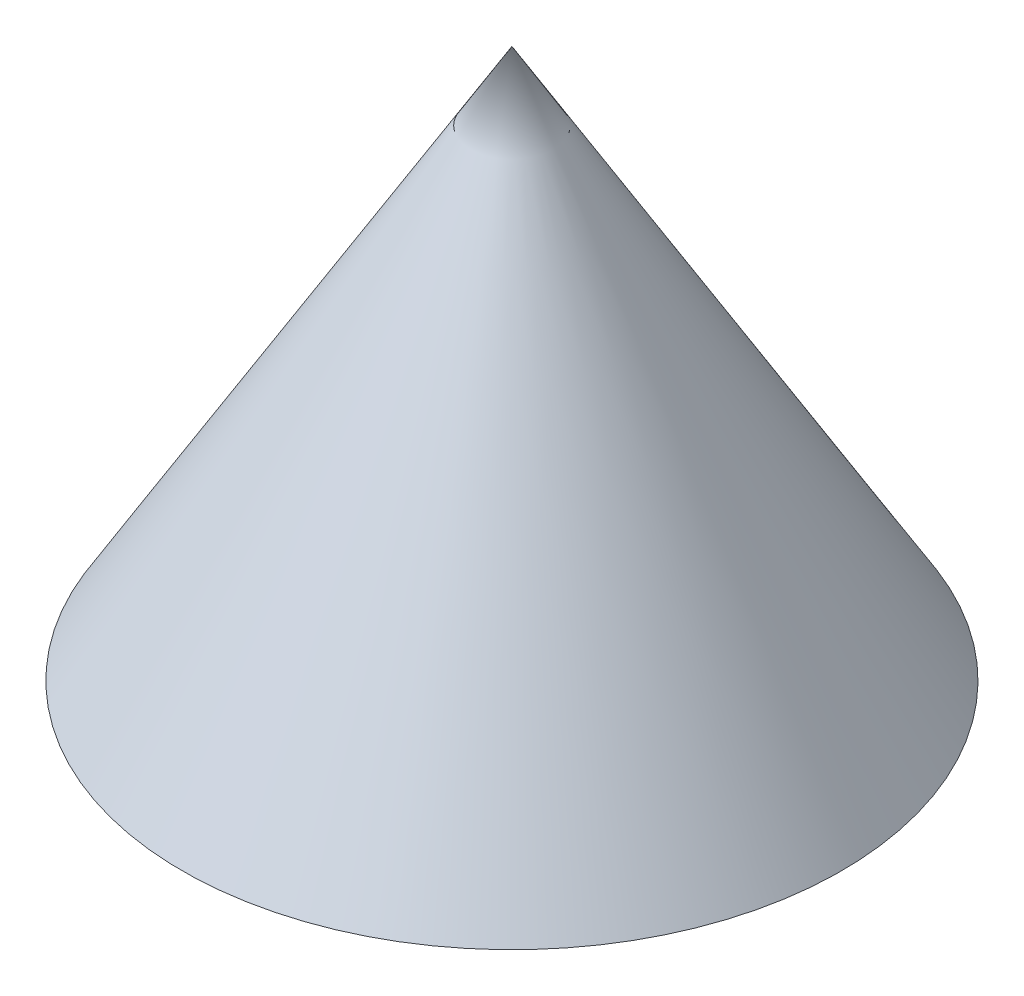
ISO-10303-21;
HEADER;
FILE_DESCRIPTION(('STEP AP214'),'2;1');
FILE_NAME('part.step','',(''),(''),'','','');
FILE_SCHEMA(('AUTOMOTIVE_DESIGN { 1 0 10303 214 1 1 1 1 }'));
ENDSEC;
DATA;
#1=APPLICATION_CONTEXT('core data for automotive mechanical design processes');
#2=APPLICATION_PROTOCOL_DEFINITION('international standard','automotive_design',2000,#1);
#3=PRODUCT_CONTEXT('',#1,'mechanical');
#4=PRODUCT('Part','Part','',(#3));
#5=PRODUCT_RELATED_PRODUCT_CATEGORY('part','',(#4));
#6=PRODUCT_DEFINITION_FORMATION('','',#4);
#7=PRODUCT_DEFINITION_CONTEXT('part definition',#1,'design');
#8=PRODUCT_DEFINITION('design','',#6,#7);
#9=PRODUCT_DEFINITION_SHAPE('','',#8);
#10=(LENGTH_UNIT() NAMED_UNIT(*) SI_UNIT(.MILLI.,.METRE.));
#11=(NAMED_UNIT(*) PLANE_ANGLE_UNIT() SI_UNIT($,.RADIAN.));
#12=(NAMED_UNIT(*) SI_UNIT($,.STERADIAN.) SOLID_ANGLE_UNIT());
#13=UNCERTAINTY_MEASURE_WITH_UNIT(LENGTH_MEASURE(1.E-05),#10,'distance_accuracy_value','');
#14=(GEOMETRIC_REPRESENTATION_CONTEXT(3) GLOBAL_UNCERTAINTY_ASSIGNED_CONTEXT((#13)) GLOBAL_UNIT_ASSIGNED_CONTEXT((#10,
#11,#12)) REPRESENTATION_CONTEXT('',''));
#15=CARTESIAN_POINT('',(0.,0.,0.));
#16=DIRECTION('',(0.,0.,1.));
#17=DIRECTION('',(1.,0.,0.));
#18=AXIS2_PLACEMENT_3D('',#15,#16,#17);
#19=CARTESIAN_POINT('',(0.,0.,0.));
#20=DIRECTION('',(0.,-1.,0.));
#21=DIRECTION('',(0.,0.,-1.));
#22=AXIS2_PLACEMENT_3D('',#19,#20,#21);
#23=PLANE('',#22);
#24=CARTESIAN_POINT('',(0.,0.,0.));
#25=DIRECTION('',(0.,-1.,0.));
#26=DIRECTION('',(0.,0.,-1.));
#27=AXIS2_PLACEMENT_3D('',#24,#25,#26);
#28=CIRCLE('',#27,150.);
#29=CARTESIAN_POINT('',(0.,0.,-150.));
#30=VERTEX_POINT('',#29);
#31=EDGE_CURVE('E11',#30,#30,#28,.T.);
#32=ORIENTED_EDGE('',*,*,#31,.T.);
#33=EDGE_LOOP('',(#32));
#34=FACE_BOUND('',#33,.T.);
#35=ADVANCED_FACE('F41',(#34),#23,.T.);
#36=CARTESIAN_POINT('',(0.,0.,0.));
#37=DIRECTION('',(0.,-1.,0.));
#38=DIRECTION('',(0.,0.,-1.));
#39=AXIS2_PLACEMENT_3D('',#36,#37,#38);
#40=CONICAL_SURFACE('',#39,150.,0.540419500270584);
#41=CARTESIAN_POINT('',(0.,250.,0.));
#42=VERTEX_POINT('',#41);
#43=VERTEX_LOOP('',#42);
#44=FACE_BOUND('',#43,.T.);
#45=ORIENTED_EDGE('',*,*,#31,.F.);
#46=EDGE_LOOP('',(#45));
#47=FACE_BOUND('',#46,.T.);
#48=ADVANCED_FACE('F48',(#44,#47),#40,.T.);
#49=CLOSED_SHELL('',(#35,#48));
#50=MANIFOLD_SOLID_BREP('B2',#49);
#51=ADVANCED_BREP_SHAPE_REPRESENTATION('',(#18,#50),#14);
#52=SHAPE_DEFINITION_REPRESENTATION(#9,#51);
ENDSEC;
END-ISO-10303-21;
